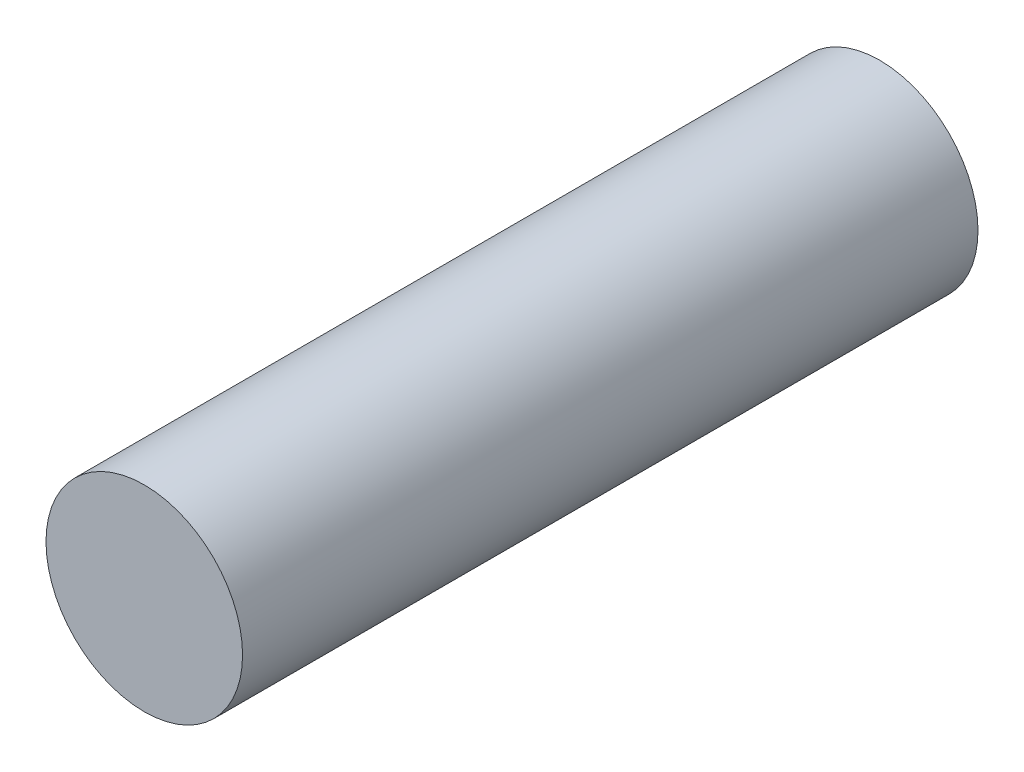
ISO-10303-21;
HEADER;
FILE_DESCRIPTION(('STEP AP214'),'2;1');
FILE_NAME('part.step','',(''),(''),'','','');
FILE_SCHEMA(('AUTOMOTIVE_DESIGN { 1 0 10303 214 1 1 1 1 }'));
ENDSEC;
DATA;
#1=APPLICATION_CONTEXT('core data for automotive mechanical design processes');
#2=APPLICATION_PROTOCOL_DEFINITION('international standard','automotive_design',2000,#1);
#3=PRODUCT_CONTEXT('',#1,'mechanical');
#4=PRODUCT('Part','Part','',(#3));
#5=PRODUCT_RELATED_PRODUCT_CATEGORY('part','',(#4));
#6=PRODUCT_DEFINITION_FORMATION('','',#4);
#7=PRODUCT_DEFINITION_CONTEXT('part definition',#1,'design');
#8=PRODUCT_DEFINITION('design','',#6,#7);
#9=PRODUCT_DEFINITION_SHAPE('','',#8);
#10=(LENGTH_UNIT() NAMED_UNIT(*) SI_UNIT(.MILLI.,.METRE.));
#11=(NAMED_UNIT(*) PLANE_ANGLE_UNIT() SI_UNIT($,.RADIAN.));
#12=(NAMED_UNIT(*) SI_UNIT($,.STERADIAN.) SOLID_ANGLE_UNIT());
#13=UNCERTAINTY_MEASURE_WITH_UNIT(LENGTH_MEASURE(1.E-05),#10,'distance_accuracy_value','');
#14=(GEOMETRIC_REPRESENTATION_CONTEXT(3) GLOBAL_UNCERTAINTY_ASSIGNED_CONTEXT((#13)) GLOBAL_UNIT_ASSIGNED_CONTEXT((#10,
#11,#12)) REPRESENTATION_CONTEXT('',''));
#15=CARTESIAN_POINT('',(0.,0.,0.));
#16=DIRECTION('',(0.,0.,1.));
#17=DIRECTION('',(1.,0.,0.));
#18=AXIS2_PLACEMENT_3D('',#15,#16,#17);
#19=CARTESIAN_POINT('',(0.,0.,6.66));
#20=DIRECTION('',(0.,0.,-1.));
#21=DIRECTION('',(-1.,0.,0.));
#22=AXIS2_PLACEMENT_3D('',#19,#20,#21);
#23=CYLINDRICAL_SURFACE('',#22,0.89);
#24=CARTESIAN_POINT('',(0.,0.,6.66));
#25=DIRECTION('',(0.,0.,1.));
#26=DIRECTION('',(1.,0.,0.));
#27=AXIS2_PLACEMENT_3D('',#24,#25,#26);
#28=CIRCLE('',#27,0.89);
#29=CARTESIAN_POINT('',(0.89,0.,6.66));
#30=VERTEX_POINT('',#29);
#31=EDGE_CURVE('E12',#30,#30,#28,.T.);
#32=ORIENTED_EDGE('',*,*,#31,.F.);
#33=EDGE_LOOP('',(#32));
#34=FACE_BOUND('',#33,.T.);
#35=CARTESIAN_POINT('',(0.,0.,0.));
#36=DIRECTION('',(0.,0.,1.));
#37=DIRECTION('',(1.,0.,0.));
#38=AXIS2_PLACEMENT_3D('',#35,#36,#37);
#39=CIRCLE('',#38,0.89);
#40=CARTESIAN_POINT('',(0.89,0.,0.));
#41=VERTEX_POINT('',#40);
#42=EDGE_CURVE('E44',#41,#41,#39,.T.);
#43=ORIENTED_EDGE('',*,*,#42,.T.);
#44=EDGE_LOOP('',(#43));
#45=FACE_BOUND('',#44,.T.);
#46=ADVANCED_FACE('F41',(#34,#45),#23,.T.);
#47=CARTESIAN_POINT('',(0.,0.,6.66));
#48=DIRECTION('',(0.,0.,1.));
#49=DIRECTION('',(1.,0.,0.));
#50=AXIS2_PLACEMENT_3D('',#47,#48,#49);
#51=PLANE('',#50);
#52=ORIENTED_EDGE('',*,*,#31,.T.);
#53=EDGE_LOOP('',(#52));
#54=FACE_BOUND('',#53,.T.);
#55=ADVANCED_FACE('F56',(#54),#51,.T.);
#56=CARTESIAN_POINT('',(0.,0.,0.));
#57=DIRECTION('',(0.,0.,1.));
#58=DIRECTION('',(1.,0.,0.));
#59=AXIS2_PLACEMENT_3D('',#56,#57,#58);
#60=PLANE('',#59);
#61=ORIENTED_EDGE('',*,*,#42,.F.);
#62=EDGE_LOOP('',(#61));
#63=FACE_BOUND('',#62,.T.);
#64=ADVANCED_FACE('F54',(#63),#60,.F.);
#65=CLOSED_SHELL('',(#46,#55,#64));
#66=MANIFOLD_SOLID_BREP('B2',#65);
#67=ADVANCED_BREP_SHAPE_REPRESENTATION('',(#18,#66),#14);
#68=SHAPE_DEFINITION_REPRESENTATION(#9,#67);
ENDSEC;
END-ISO-10303-21;
